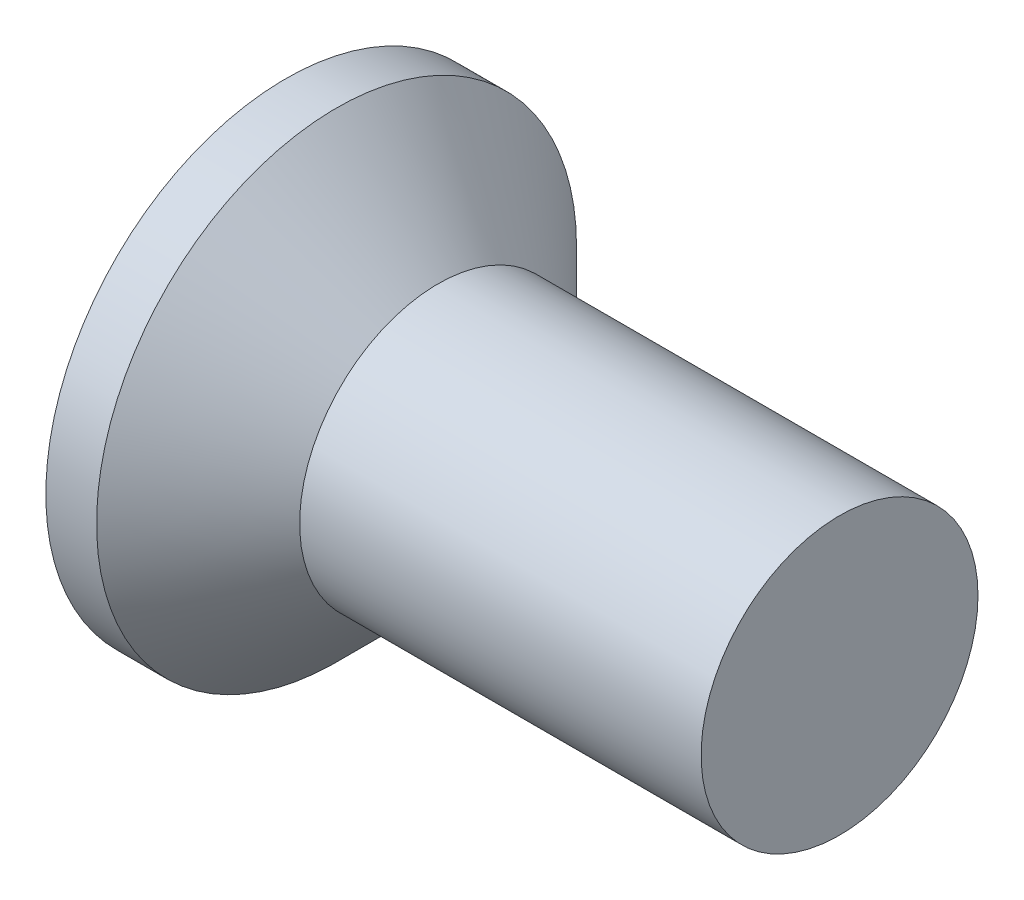
ISO-10303-21;
HEADER;
FILE_DESCRIPTION(('STEP AP214'),'2;1');
FILE_NAME('part.step','',(''),(''),'','','');
FILE_SCHEMA(('AUTOMOTIVE_DESIGN { 1 0 10303 214 1 1 1 1 }'));
ENDSEC;
DATA;
#1=APPLICATION_CONTEXT('core data for automotive mechanical design processes');
#2=APPLICATION_PROTOCOL_DEFINITION('international standard','automotive_design',2000,#1);
#3=PRODUCT_CONTEXT('',#1,'mechanical');
#4=PRODUCT('Part','Part','',(#3));
#5=PRODUCT_RELATED_PRODUCT_CATEGORY('part','',(#4));
#6=PRODUCT_DEFINITION_FORMATION('','',#4);
#7=PRODUCT_DEFINITION_CONTEXT('part definition',#1,'design');
#8=PRODUCT_DEFINITION('design','',#6,#7);
#9=PRODUCT_DEFINITION_SHAPE('','',#8);
#10=(LENGTH_UNIT() NAMED_UNIT(*) SI_UNIT(.MILLI.,.METRE.));
#11=(NAMED_UNIT(*) PLANE_ANGLE_UNIT() SI_UNIT($,.RADIAN.));
#12=(NAMED_UNIT(*) SI_UNIT($,.STERADIAN.) SOLID_ANGLE_UNIT());
#13=UNCERTAINTY_MEASURE_WITH_UNIT(LENGTH_MEASURE(1.E-05),#10,'distance_accuracy_value','');
#14=(GEOMETRIC_REPRESENTATION_CONTEXT(3) GLOBAL_UNCERTAINTY_ASSIGNED_CONTEXT((#13)) GLOBAL_UNIT_ASSIGNED_CONTEXT((#10,
#11,#12)) REPRESENTATION_CONTEXT('',''));
#15=CARTESIAN_POINT('',(0.,0.,0.));
#16=DIRECTION('',(0.,0.,1.));
#17=DIRECTION('',(1.,0.,0.));
#18=AXIS2_PLACEMENT_3D('',#15,#16,#17);
#19=CARTESIAN_POINT('',(0.,2.59999999999999,0.));
#20=DIRECTION('',(-1.,0.,0.));
#21=DIRECTION('',(0.,0.,1.));
#22=AXIS2_PLACEMENT_3D('',#19,#20,#21);
#23=PLANE('',#22);
#24=CARTESIAN_POINT('',(0.,0.,0.));
#25=DIRECTION('',(1.,0.,0.));
#26=DIRECTION('',(0.,0.,-1.));
#27=AXIS2_PLACEMENT_3D('',#24,#25,#26);
#28=CIRCLE('',#27,2.59999999999999);
#29=CARTESIAN_POINT('',(0.,0.,-2.59999999999999));
#30=VERTEX_POINT('',#29);
#31=EDGE_CURVE('E181',#30,#30,#28,.T.);
#32=ORIENTED_EDGE('',*,*,#31,.F.);
#33=EDGE_LOOP('',(#32));
#34=FACE_BOUND('',#33,.T.);
#35=DIRECTION('',(0.,1.,0.));
#36=VECTOR('',#35,1.);
#37=CARTESIAN_POINT('',(0.,-0.32,-0.32));
#38=LINE('',#37,#36);
#39=CARTESIAN_POINT('',(0.,-1.6,-0.32));
#40=VERTEX_POINT('',#39);
#41=CARTESIAN_POINT('',(0.,-0.62,-0.32));
#42=VERTEX_POINT('',#41);
#43=EDGE_CURVE('E307',#40,#42,#38,.T.);
#44=ORIENTED_EDGE('',*,*,#43,.T.);
#45=CARTESIAN_POINT('',(0.,-0.62,-0.62));
#46=DIRECTION('',(-1.,0.,0.));
#47=DIRECTION('',(0.,0.,1.));
#48=AXIS2_PLACEMENT_3D('',#45,#46,#47);
#49=CIRCLE('',#48,0.3);
#50=CARTESIAN_POINT('',(0.,-0.32,-0.62));
#51=VERTEX_POINT('',#50);
#52=EDGE_CURVE('E186',#42,#51,#49,.T.);
#53=ORIENTED_EDGE('',*,*,#52,.T.);
#54=DIRECTION('',(0.,0.,-1.));
#55=VECTOR('',#54,1.);
#56=CARTESIAN_POINT('',(0.,-0.32,-0.32));
#57=LINE('',#56,#55);
#58=CARTESIAN_POINT('',(0.,-0.32,-1.6));
#59=VERTEX_POINT('',#58);
#60=EDGE_CURVE('E309',#51,#59,#57,.T.);
#61=ORIENTED_EDGE('',*,*,#60,.T.);
#62=DIRECTION('',(0.,1.,0.));
#63=VECTOR('',#62,1.);
#64=CARTESIAN_POINT('',(0.,0.32,-1.6));
#65=LINE('',#64,#63);
#66=CARTESIAN_POINT('',(0.,0.32,-1.6));
#67=VERTEX_POINT('',#66);
#68=EDGE_CURVE('E311',#59,#67,#65,.T.);
#69=ORIENTED_EDGE('',*,*,#68,.T.);
#70=DIRECTION('',(0.,0.,1.));
#71=VECTOR('',#70,1.);
#72=CARTESIAN_POINT('',(0.,0.32,-0.32));
#73=LINE('',#72,#71);
#74=CARTESIAN_POINT('',(0.,0.32,-0.62));
#75=VERTEX_POINT('',#74);
#76=EDGE_CURVE('E314',#67,#75,#73,.T.);
#77=ORIENTED_EDGE('',*,*,#76,.T.);
#78=CARTESIAN_POINT('',(0.,0.62,-0.62));
#79=DIRECTION('',(-1.,0.,0.));
#80=DIRECTION('',(0.,0.,1.));
#81=AXIS2_PLACEMENT_3D('',#78,#79,#80);
#82=CIRCLE('',#81,0.3);
#83=CARTESIAN_POINT('',(0.,0.62,-0.32));
#84=VERTEX_POINT('',#83);
#85=EDGE_CURVE('E184',#75,#84,#82,.T.);
#86=ORIENTED_EDGE('',*,*,#85,.T.);
#87=DIRECTION('',(0.,1.,0.));
#88=VECTOR('',#87,1.);
#89=CARTESIAN_POINT('',(0.,0.32,-0.32));
#90=LINE('',#89,#88);
#91=CARTESIAN_POINT('',(0.,1.6,-0.32));
#92=VERTEX_POINT('',#91);
#93=EDGE_CURVE('E317',#84,#92,#90,.T.);
#94=ORIENTED_EDGE('',*,*,#93,.T.);
#95=DIRECTION('',(0.,0.,1.));
#96=VECTOR('',#95,1.);
#97=CARTESIAN_POINT('',(0.,1.6,-0.32));
#98=LINE('',#97,#96);
#99=CARTESIAN_POINT('',(0.,1.6,0.32));
#100=VERTEX_POINT('',#99);
#101=EDGE_CURVE('E319',#92,#100,#98,.T.);
#102=ORIENTED_EDGE('',*,*,#101,.T.);
#103=DIRECTION('',(0.,-1.,0.));
#104=VECTOR('',#103,1.);
#105=CARTESIAN_POINT('',(0.,0.32,0.32));
#106=LINE('',#105,#104);
#107=CARTESIAN_POINT('',(0.,0.62,0.32));
#108=VERTEX_POINT('',#107);
#109=EDGE_CURVE('E322',#100,#108,#106,.T.);
#110=ORIENTED_EDGE('',*,*,#109,.T.);
#111=CARTESIAN_POINT('',(0.,0.62,0.62));
#112=DIRECTION('',(-1.,0.,0.));
#113=DIRECTION('',(0.,0.,1.));
#114=AXIS2_PLACEMENT_3D('',#111,#112,#113);
#115=CIRCLE('',#114,0.3);
#116=CARTESIAN_POINT('',(0.,0.32,0.62));
#117=VERTEX_POINT('',#116);
#118=EDGE_CURVE('E149',#108,#117,#115,.T.);
#119=ORIENTED_EDGE('',*,*,#118,.T.);
#120=DIRECTION('',(0.,0.,1.));
#121=VECTOR('',#120,1.);
#122=CARTESIAN_POINT('',(0.,0.32,0.32));
#123=LINE('',#122,#121);
#124=CARTESIAN_POINT('',(0.,0.32,1.6));
#125=VERTEX_POINT('',#124);
#126=EDGE_CURVE('E143',#117,#125,#123,.T.);
#127=ORIENTED_EDGE('',*,*,#126,.T.);
#128=DIRECTION('',(0.,-1.,0.));
#129=VECTOR('',#128,1.);
#130=CARTESIAN_POINT('',(0.,0.32,1.6));
#131=LINE('',#130,#129);
#132=CARTESIAN_POINT('',(0.,-0.32,1.6));
#133=VERTEX_POINT('',#132);
#134=EDGE_CURVE('E147',#125,#133,#131,.T.);
#135=ORIENTED_EDGE('',*,*,#134,.T.);
#136=DIRECTION('',(0.,0.,-1.));
#137=VECTOR('',#136,1.);
#138=CARTESIAN_POINT('',(0.,-0.32,0.32));
#139=LINE('',#138,#137);
#140=CARTESIAN_POINT('',(0.,-0.32,0.62));
#141=VERTEX_POINT('',#140);
#142=EDGE_CURVE('E161',#133,#141,#139,.T.);
#143=ORIENTED_EDGE('',*,*,#142,.T.);
#144=CARTESIAN_POINT('',(0.,-0.62,0.62));
#145=DIRECTION('',(-1.,0.,0.));
#146=DIRECTION('',(0.,0.,1.));
#147=AXIS2_PLACEMENT_3D('',#144,#145,#146);
#148=CIRCLE('',#147,0.3);
#149=CARTESIAN_POINT('',(0.,-0.62,0.32));
#150=VERTEX_POINT('',#149);
#151=EDGE_CURVE('E180',#141,#150,#148,.T.);
#152=ORIENTED_EDGE('',*,*,#151,.T.);
#153=DIRECTION('',(0.,-1.,0.));
#154=VECTOR('',#153,1.);
#155=CARTESIAN_POINT('',(0.,-0.32,0.32));
#156=LINE('',#155,#154);
#157=CARTESIAN_POINT('',(0.,-1.6,0.319999999999999));
#158=VERTEX_POINT('',#157);
#159=EDGE_CURVE('E302',#150,#158,#156,.T.);
#160=ORIENTED_EDGE('',*,*,#159,.T.);
#161=DIRECTION('',(0.,0.,-1.));
#162=VECTOR('',#161,1.);
#163=CARTESIAN_POINT('',(0.,-1.6,-0.32));
#164=LINE('',#163,#162);
#165=EDGE_CURVE('E304',#158,#40,#164,.T.);
#166=ORIENTED_EDGE('',*,*,#165,.T.);
#167=EDGE_LOOP('',(#44,#53,#61,#69,#77,#86,#94,#102,#110,#119,#127,#135,#143,#152,#160,#166));
#168=FACE_BOUND('',#167,.T.);
#169=ADVANCED_FACE('F30',(#34,#168),#23,.T.);
#170=CARTESIAN_POINT('',(5.99999999999999,1.49999999999999,0.));
#171=DIRECTION('',(1.,0.,0.));
#172=DIRECTION('',(0.,0.,-1.));
#173=AXIS2_PLACEMENT_3D('',#170,#171,#172);
#174=PLANE('',#173);
#175=CARTESIAN_POINT('',(5.99999999999999,0.,0.));
#176=DIRECTION('',(1.,0.,0.));
#177=DIRECTION('',(0.,0.,-1.));
#178=AXIS2_PLACEMENT_3D('',#175,#176,#177);
#179=CIRCLE('',#178,1.49999999999999);
#180=CARTESIAN_POINT('',(5.99999999999999,0.,-1.49999999999999));
#181=VERTEX_POINT('',#180);
#182=EDGE_CURVE('E167',#181,#181,#179,.T.);
#183=ORIENTED_EDGE('',*,*,#182,.T.);
#184=EDGE_LOOP('',(#183));
#185=FACE_BOUND('',#184,.T.);
#186=ADVANCED_FACE('F234',(#185),#174,.T.);
#187=CARTESIAN_POINT('',(4.51581291088132,0.,0.));
#188=DIRECTION('',(1.,0.,0.));
#189=DIRECTION('',(0.,0.,-1.));
#190=AXIS2_PLACEMENT_3D('',#187,#188,#189);
#191=CYLINDRICAL_SURFACE('',#190,2.59999999999999);
#192=ORIENTED_EDGE('',*,*,#31,.T.);
#193=EDGE_LOOP('',(#192));
#194=FACE_BOUND('',#193,.T.);
#195=CARTESIAN_POINT('',(0.550000000000004,0.,0.));
#196=DIRECTION('',(1.,0.,0.));
#197=DIRECTION('',(0.,0.,-1.));
#198=AXIS2_PLACEMENT_3D('',#195,#196,#197);
#199=CIRCLE('',#198,2.59999999999999);
#200=CARTESIAN_POINT('',(0.550000000000004,0.,-2.59999999999999));
#201=VERTEX_POINT('',#200);
#202=EDGE_CURVE('E326',#201,#201,#199,.T.);
#203=ORIENTED_EDGE('',*,*,#202,.F.);
#204=EDGE_LOOP('',(#203));
#205=FACE_BOUND('',#204,.T.);
#206=ADVANCED_FACE('F240',(#194,#205),#191,.T.);
#207=CARTESIAN_POINT('',(1.65,0.,0.));
#208=DIRECTION('',(-1.,0.,0.));
#209=DIRECTION('',(0.,0.,1.));
#210=AXIS2_PLACEMENT_3D('',#207,#208,#209);
#211=CONICAL_SURFACE('',#210,1.49999999999999,0.78539816339745);
#212=ORIENTED_EDGE('',*,*,#202,.T.);
#213=EDGE_LOOP('',(#212));
#214=FACE_BOUND('',#213,.T.);
#215=CARTESIAN_POINT('',(1.65,0.,0.));
#216=DIRECTION('',(1.,0.,0.));
#217=DIRECTION('',(0.,0.,-1.));
#218=AXIS2_PLACEMENT_3D('',#215,#216,#217);
#219=CIRCLE('',#218,1.49999999999999);
#220=CARTESIAN_POINT('',(1.65,0.,-1.49999999999999));
#221=VERTEX_POINT('',#220);
#222=EDGE_CURVE('E170',#221,#221,#219,.T.);
#223=ORIENTED_EDGE('',*,*,#222,.F.);
#224=EDGE_LOOP('',(#223));
#225=FACE_BOUND('',#224,.T.);
#226=ADVANCED_FACE('F362',(#214,#225),#211,.T.);
#227=CARTESIAN_POINT('',(4.51581291088132,0.,0.));
#228=DIRECTION('',(1.,0.,0.));
#229=DIRECTION('',(0.,0.,-1.));
#230=AXIS2_PLACEMENT_3D('',#227,#228,#229);
#231=CYLINDRICAL_SURFACE('',#230,1.49999999999999);
#232=ORIENTED_EDGE('',*,*,#222,.T.);
#233=EDGE_LOOP('',(#232));
#234=FACE_BOUND('',#233,.T.);
#235=ORIENTED_EDGE('',*,*,#182,.F.);
#236=EDGE_LOOP('',(#235));
#237=FACE_BOUND('',#236,.T.);
#238=ADVANCED_FACE('F360',(#234,#237),#231,.T.);
#239=CARTESIAN_POINT('',(0.825,0.32,0.32));
#240=DIRECTION('',(0.,-1.,0.));
#241=DIRECTION('',(0.,0.,-1.));
#242=AXIS2_PLACEMENT_3D('',#239,#240,#241);
#243=PLANE('',#242);
#244=ORIENTED_EDGE('',*,*,#126,.F.);
#245=DIRECTION('',(-1.,0.,0.));
#246=VECTOR('',#245,1.);
#247=CARTESIAN_POINT('',(0.825,0.32,0.62));
#248=LINE('',#247,#246);
#249=CARTESIAN_POINT('',(0.825,0.32,0.62));
#250=VERTEX_POINT('',#249);
#251=EDGE_CURVE('E198',#117,#250,#248,.F.);
#252=ORIENTED_EDGE('',*,*,#251,.T.);
#253=DIRECTION('',(0.,0.,1.));
#254=VECTOR('',#253,1.);
#255=CARTESIAN_POINT('',(0.825,0.32,0.32));
#256=LINE('',#255,#254);
#257=CARTESIAN_POINT('',(0.825,0.32,1.12368602791856));
#258=VERTEX_POINT('',#257);
#259=EDGE_CURVE('E165',#250,#258,#256,.T.);
#260=ORIENTED_EDGE('',*,*,#259,.T.);
#261=DIRECTION('',(-0.866025403784438,0.,0.500000000000001));
#262=VECTOR('',#261,1.);
#263=CARTESIAN_POINT('',(0.,0.32,1.6));
#264=LINE('',#263,#262);
#265=EDGE_CURVE('E157',#258,#125,#264,.T.);
#266=ORIENTED_EDGE('',*,*,#265,.T.);
#267=EDGE_LOOP('',(#244,#252,#260,#266));
#268=FACE_BOUND('',#267,.T.);
#269=ADVANCED_FACE('F163',(#268),#243,.T.);
#270=CARTESIAN_POINT('',(0.,0.32,1.6));
#271=DIRECTION('',(-0.500000000000001,0.,-0.866025403784438));
#272=DIRECTION('',(-0.866025403784438,0.,0.500000000000001));
#273=AXIS2_PLACEMENT_3D('',#270,#271,#272);
#274=PLANE('',#273);
#275=ORIENTED_EDGE('',*,*,#134,.F.);
#276=ORIENTED_EDGE('',*,*,#265,.F.);
#277=DIRECTION('',(0.,-1.,0.));
#278=VECTOR('',#277,1.);
#279=CARTESIAN_POINT('',(0.825,0.32,1.12368602791856));
#280=LINE('',#279,#278);
#281=CARTESIAN_POINT('',(0.825,-0.32,1.12368602791856));
#282=VERTEX_POINT('',#281);
#283=EDGE_CURVE('E176',#258,#282,#280,.T.);
#284=ORIENTED_EDGE('',*,*,#283,.T.);
#285=DIRECTION('',(-0.866025403784438,0.,0.500000000000001));
#286=VECTOR('',#285,1.);
#287=CARTESIAN_POINT('',(1.17300625842204,-0.32,0.922764520938917));
#288=LINE('',#287,#286);
#289=EDGE_CURVE('E159',#282,#133,#288,.T.);
#290=ORIENTED_EDGE('',*,*,#289,.T.);
#291=EDGE_LOOP('',(#275,#276,#284,#290));
#292=FACE_BOUND('',#291,.T.);
#293=ADVANCED_FACE('F156',(#292),#274,.T.);
#294=CARTESIAN_POINT('',(0.825,-0.32,0.32));
#295=DIRECTION('',(0.,1.,0.));
#296=DIRECTION('',(0.,0.,1.));
#297=AXIS2_PLACEMENT_3D('',#294,#295,#296);
#298=PLANE('',#297);
#299=DIRECTION('',(0.,0.,-1.));
#300=VECTOR('',#299,1.);
#301=CARTESIAN_POINT('',(0.825,-0.32,0.32));
#302=LINE('',#301,#300);
#303=CARTESIAN_POINT('',(0.825,-0.32,0.62));
#304=VERTEX_POINT('',#303);
#305=EDGE_CURVE('E348',#282,#304,#302,.T.);
#306=ORIENTED_EDGE('',*,*,#305,.T.);
#307=DIRECTION('',(-1.,0.,0.));
#308=VECTOR('',#307,1.);
#309=CARTESIAN_POINT('',(0.825,-0.32,0.62));
#310=LINE('',#309,#308);
#311=EDGE_CURVE('E200',#304,#141,#310,.T.);
#312=ORIENTED_EDGE('',*,*,#311,.T.);
#313=ORIENTED_EDGE('',*,*,#142,.F.);
#314=ORIENTED_EDGE('',*,*,#289,.F.);
#315=EDGE_LOOP('',(#306,#312,#313,#314));
#316=FACE_BOUND('',#315,.T.);
#317=ADVANCED_FACE('F254',(#316),#298,.T.);
#318=CARTESIAN_POINT('',(0.825,-0.32,0.32));
#319=DIRECTION('',(0.,0.,-1.));
#320=DIRECTION('',(0.,1.,0.));
#321=AXIS2_PLACEMENT_3D('',#318,#319,#320);
#322=PLANE('',#321);
#323=ORIENTED_EDGE('',*,*,#159,.F.);
#324=DIRECTION('',(-1.,0.,0.));
#325=VECTOR('',#324,1.);
#326=CARTESIAN_POINT('',(0.825,-0.62,0.32));
#327=LINE('',#326,#325);
#328=CARTESIAN_POINT('',(0.825,-0.62,0.32));
#329=VERTEX_POINT('',#328);
#330=EDGE_CURVE('E45',#150,#329,#327,.F.);
#331=ORIENTED_EDGE('',*,*,#330,.T.);
#332=DIRECTION('',(0.,-1.,0.));
#333=VECTOR('',#332,1.);
#334=CARTESIAN_POINT('',(0.825,-0.32,0.32));
#335=LINE('',#334,#333);
#336=CARTESIAN_POINT('',(0.825,-1.12368602791856,0.319999999999999));
#337=VERTEX_POINT('',#336);
#338=EDGE_CURVE('E291',#329,#337,#335,.T.);
#339=ORIENTED_EDGE('',*,*,#338,.T.);
#340=DIRECTION('',(-0.866025403784438,-0.500000000000001,0.));
#341=VECTOR('',#340,1.);
#342=CARTESIAN_POINT('',(0.,-1.6,0.319999999999999));
#343=LINE('',#342,#341);
#344=EDGE_CURVE('E172',#337,#158,#343,.T.);
#345=ORIENTED_EDGE('',*,*,#344,.T.);
#346=EDGE_LOOP('',(#323,#331,#339,#345));
#347=FACE_BOUND('',#346,.T.);
#348=ADVANCED_FACE('F259',(#347),#322,.T.);
#349=CARTESIAN_POINT('',(0.,-1.6,-0.32));
#350=DIRECTION('',(-0.500000000000001,0.866025403784438,0.));
#351=DIRECTION('',(-0.866025403784438,-0.500000000000001,0.));
#352=AXIS2_PLACEMENT_3D('',#349,#350,#351);
#353=PLANE('',#352);
#354=ORIENTED_EDGE('',*,*,#165,.F.);
#355=ORIENTED_EDGE('',*,*,#344,.F.);
#356=DIRECTION('',(0.,0.,-1.));
#357=VECTOR('',#356,1.);
#358=CARTESIAN_POINT('',(0.825,-1.12368602791856,-0.32));
#359=LINE('',#358,#357);
#360=CARTESIAN_POINT('',(0.825,-1.12368602791856,-0.32));
#361=VERTEX_POINT('',#360);
#362=EDGE_CURVE('E287',#337,#361,#359,.T.);
#363=ORIENTED_EDGE('',*,*,#362,.T.);
#364=DIRECTION('',(-0.866025403784438,-0.500000000000001,0.));
#365=VECTOR('',#364,1.);
#366=CARTESIAN_POINT('',(1.17300625842204,-0.922764520938917,-0.32));
#367=LINE('',#366,#365);
#368=EDGE_CURVE('E286',#361,#40,#367,.T.);
#369=ORIENTED_EDGE('',*,*,#368,.T.);
#370=EDGE_LOOP('',(#354,#355,#363,#369));
#371=FACE_BOUND('',#370,.T.);
#372=ADVANCED_FACE('F255',(#371),#353,.T.);
#373=CARTESIAN_POINT('',(0.825,-0.32,-0.32));
#374=DIRECTION('',(0.,0.,1.));
#375=DIRECTION('',(0.,-1.,0.));
#376=AXIS2_PLACEMENT_3D('',#373,#374,#375);
#377=PLANE('',#376);
#378=DIRECTION('',(0.,1.,0.));
#379=VECTOR('',#378,1.);
#380=CARTESIAN_POINT('',(0.825,-0.32,-0.32));
#381=LINE('',#380,#379);
#382=CARTESIAN_POINT('',(0.825,-0.62,-0.32));
#383=VERTEX_POINT('',#382);
#384=EDGE_CURVE('E280',#361,#383,#381,.T.);
#385=ORIENTED_EDGE('',*,*,#384,.T.);
#386=DIRECTION('',(-1.,0.,0.));
#387=VECTOR('',#386,1.);
#388=CARTESIAN_POINT('',(0.825,-0.62,-0.32));
#389=LINE('',#388,#387);
#390=EDGE_CURVE('E177',#383,#42,#389,.T.);
#391=ORIENTED_EDGE('',*,*,#390,.T.);
#392=ORIENTED_EDGE('',*,*,#43,.F.);
#393=ORIENTED_EDGE('',*,*,#368,.F.);
#394=EDGE_LOOP('',(#385,#391,#392,#393));
#395=FACE_BOUND('',#394,.T.);
#396=ADVANCED_FACE('F258',(#395),#377,.T.);
#397=CARTESIAN_POINT('',(0.825,-0.32,-0.32));
#398=DIRECTION('',(0.,1.,0.));
#399=DIRECTION('',(0.,0.,1.));
#400=AXIS2_PLACEMENT_3D('',#397,#398,#399);
#401=PLANE('',#400);
#402=ORIENTED_EDGE('',*,*,#60,.F.);
#403=DIRECTION('',(-1.,0.,0.));
#404=VECTOR('',#403,1.);
#405=CARTESIAN_POINT('',(0.825,-0.32,-0.62));
#406=LINE('',#405,#404);
#407=CARTESIAN_POINT('',(0.825,-0.32,-0.62));
#408=VERTEX_POINT('',#407);
#409=EDGE_CURVE('E188',#51,#408,#406,.F.);
#410=ORIENTED_EDGE('',*,*,#409,.T.);
#411=DIRECTION('',(0.,0.,-1.));
#412=VECTOR('',#411,1.);
#413=CARTESIAN_POINT('',(0.825,-0.32,-0.32));
#414=LINE('',#413,#412);
#415=CARTESIAN_POINT('',(0.825,-0.32,-1.12368602791856));
#416=VERTEX_POINT('',#415);
#417=EDGE_CURVE('E282',#408,#416,#414,.T.);
#418=ORIENTED_EDGE('',*,*,#417,.T.);
#419=DIRECTION('',(-0.866025403784438,0.,-0.500000000000001));
#420=VECTOR('',#419,1.);
#421=CARTESIAN_POINT('',(0.,-0.32,-1.6));
#422=LINE('',#421,#420);
#423=EDGE_CURVE('E338',#416,#59,#422,.T.);
#424=ORIENTED_EDGE('',*,*,#423,.T.);
#425=EDGE_LOOP('',(#402,#410,#418,#424));
#426=FACE_BOUND('',#425,.T.);
#427=ADVANCED_FACE('F265',(#426),#401,.T.);
#428=CARTESIAN_POINT('',(0.,0.32,-1.6));
#429=DIRECTION('',(-0.500000000000001,0.,0.866025403784438));
#430=DIRECTION('',(0.866025403784438,0.,0.500000000000001));
#431=AXIS2_PLACEMENT_3D('',#428,#429,#430);
#432=PLANE('',#431);
#433=ORIENTED_EDGE('',*,*,#68,.F.);
#434=ORIENTED_EDGE('',*,*,#423,.F.);
#435=DIRECTION('',(0.,1.,0.));
#436=VECTOR('',#435,1.);
#437=CARTESIAN_POINT('',(0.825,0.32,-1.12368602791856));
#438=LINE('',#437,#436);
#439=CARTESIAN_POINT('',(0.825,0.32,-1.12368602791856));
#440=VERTEX_POINT('',#439);
#441=EDGE_CURVE('E289',#416,#440,#438,.T.);
#442=ORIENTED_EDGE('',*,*,#441,.T.);
#443=DIRECTION('',(-0.866025403784438,0.,-0.500000000000001));
#444=VECTOR('',#443,1.);
#445=CARTESIAN_POINT('',(1.17300625842204,0.32,-0.922764520938917));
#446=LINE('',#445,#444);
#447=EDGE_CURVE('E336',#440,#67,#446,.T.);
#448=ORIENTED_EDGE('',*,*,#447,.T.);
#449=EDGE_LOOP('',(#433,#434,#442,#448));
#450=FACE_BOUND('',#449,.T.);
#451=ADVANCED_FACE('F261',(#450),#432,.T.);
#452=CARTESIAN_POINT('',(0.825,0.32,-0.32));
#453=DIRECTION('',(0.,-1.,0.));
#454=DIRECTION('',(0.,0.,-1.));
#455=AXIS2_PLACEMENT_3D('',#452,#453,#454);
#456=PLANE('',#455);
#457=DIRECTION('',(0.,0.,1.));
#458=VECTOR('',#457,1.);
#459=CARTESIAN_POINT('',(0.825,0.32,-0.32));
#460=LINE('',#459,#458);
#461=CARTESIAN_POINT('',(0.825,0.32,-0.62));
#462=VERTEX_POINT('',#461);
#463=EDGE_CURVE('E296',#440,#462,#460,.T.);
#464=ORIENTED_EDGE('',*,*,#463,.T.);
#465=DIRECTION('',(-1.,0.,0.));
#466=VECTOR('',#465,1.);
#467=CARTESIAN_POINT('',(0.825,0.32,-0.62));
#468=LINE('',#467,#466);
#469=EDGE_CURVE('E190',#462,#75,#468,.T.);
#470=ORIENTED_EDGE('',*,*,#469,.T.);
#471=ORIENTED_EDGE('',*,*,#76,.F.);
#472=ORIENTED_EDGE('',*,*,#447,.F.);
#473=EDGE_LOOP('',(#464,#470,#471,#472));
#474=FACE_BOUND('',#473,.T.);
#475=ADVANCED_FACE('F264',(#474),#456,.T.);
#476=CARTESIAN_POINT('',(0.825,0.32,-0.32));
#477=DIRECTION('',(0.,0.,1.));
#478=DIRECTION('',(0.,-1.,0.));
#479=AXIS2_PLACEMENT_3D('',#476,#477,#478);
#480=PLANE('',#479);
#481=ORIENTED_EDGE('',*,*,#93,.F.);
#482=DIRECTION('',(-1.,0.,0.));
#483=VECTOR('',#482,1.);
#484=CARTESIAN_POINT('',(0.825,0.62,-0.32));
#485=LINE('',#484,#483);
#486=CARTESIAN_POINT('',(0.825,0.62,-0.32));
#487=VERTEX_POINT('',#486);
#488=EDGE_CURVE('E193',#84,#487,#485,.F.);
#489=ORIENTED_EDGE('',*,*,#488,.T.);
#490=DIRECTION('',(0.,1.,0.));
#491=VECTOR('',#490,1.);
#492=CARTESIAN_POINT('',(0.825,0.32,-0.32));
#493=LINE('',#492,#491);
#494=CARTESIAN_POINT('',(0.825,1.12368602791856,-0.32));
#495=VERTEX_POINT('',#494);
#496=EDGE_CURVE('E299',#487,#495,#493,.T.);
#497=ORIENTED_EDGE('',*,*,#496,.T.);
#498=DIRECTION('',(-0.866025403784438,0.500000000000001,0.));
#499=VECTOR('',#498,1.);
#500=CARTESIAN_POINT('',(0.,1.6,-0.32));
#501=LINE('',#500,#499);
#502=EDGE_CURVE('E332',#495,#92,#501,.T.);
#503=ORIENTED_EDGE('',*,*,#502,.T.);
#504=EDGE_LOOP('',(#481,#489,#497,#503));
#505=FACE_BOUND('',#504,.T.);
#506=ADVANCED_FACE('F250',(#505),#480,.T.);
#507=CARTESIAN_POINT('',(0.,1.6,-0.32));
#508=DIRECTION('',(-0.500000000000001,-0.866025403784438,0.));
#509=DIRECTION('',(0.866025403784438,-0.500000000000001,0.));
#510=AXIS2_PLACEMENT_3D('',#507,#508,#509);
#511=PLANE('',#510);
#512=ORIENTED_EDGE('',*,*,#101,.F.);
#513=ORIENTED_EDGE('',*,*,#502,.F.);
#514=DIRECTION('',(0.,0.,1.));
#515=VECTOR('',#514,1.);
#516=CARTESIAN_POINT('',(0.825,1.12368602791856,-0.32));
#517=LINE('',#516,#515);
#518=CARTESIAN_POINT('',(0.825,1.12368602791856,0.32));
#519=VERTEX_POINT('',#518);
#520=EDGE_CURVE('E220',#495,#519,#517,.T.);
#521=ORIENTED_EDGE('',*,*,#520,.T.);
#522=DIRECTION('',(-0.866025403784438,0.500000000000001,0.));
#523=VECTOR('',#522,1.);
#524=CARTESIAN_POINT('',(1.17300625842204,0.922764520938917,0.32));
#525=LINE('',#524,#523);
#526=EDGE_CURVE('E219',#519,#100,#525,.T.);
#527=ORIENTED_EDGE('',*,*,#526,.T.);
#528=EDGE_LOOP('',(#512,#513,#521,#527));
#529=FACE_BOUND('',#528,.T.);
#530=ADVANCED_FACE('F247',(#529),#511,.T.);
#531=CARTESIAN_POINT('',(0.825,0.32,0.32));
#532=DIRECTION('',(0.,0.,-1.));
#533=DIRECTION('',(0.,1.,0.));
#534=AXIS2_PLACEMENT_3D('',#531,#532,#533);
#535=PLANE('',#534);
#536=DIRECTION('',(0.,-1.,0.));
#537=VECTOR('',#536,1.);
#538=CARTESIAN_POINT('',(0.825,0.32,0.32));
#539=LINE('',#538,#537);
#540=CARTESIAN_POINT('',(0.825,0.62,0.32));
#541=VERTEX_POINT('',#540);
#542=EDGE_CURVE('E212',#519,#541,#539,.T.);
#543=ORIENTED_EDGE('',*,*,#542,.T.);
#544=DIRECTION('',(-1.,0.,0.));
#545=VECTOR('',#544,1.);
#546=CARTESIAN_POINT('',(0.825,0.62,0.32));
#547=LINE('',#546,#545);
#548=EDGE_CURVE('E195',#541,#108,#547,.T.);
#549=ORIENTED_EDGE('',*,*,#548,.T.);
#550=ORIENTED_EDGE('',*,*,#109,.F.);
#551=ORIENTED_EDGE('',*,*,#526,.F.);
#552=EDGE_LOOP('',(#543,#549,#550,#551));
#553=FACE_BOUND('',#552,.T.);
#554=ADVANCED_FACE('F217',(#553),#535,.T.);
#555=CARTESIAN_POINT('',(0.825,0.32,0.32));
#556=DIRECTION('',(1.,0.,0.));
#557=DIRECTION('',(0.,0.,-1.));
#558=AXIS2_PLACEMENT_3D('',#555,#556,#557);
#559=PLANE('',#558);
#560=ORIENTED_EDGE('',*,*,#259,.F.);
#561=CARTESIAN_POINT('',(0.825,0.62,0.62));
#562=DIRECTION('',(1.,0.,0.));
#563=DIRECTION('',(0.,0.,-1.));
#564=AXIS2_PLACEMENT_3D('',#561,#562,#563);
#565=CIRCLE('',#564,0.3);
#566=EDGE_CURVE('E38',#250,#541,#565,.T.);
#567=ORIENTED_EDGE('',*,*,#566,.T.);
#568=ORIENTED_EDGE('',*,*,#542,.F.);
#569=ORIENTED_EDGE('',*,*,#520,.F.);
#570=ORIENTED_EDGE('',*,*,#496,.F.);
#571=CARTESIAN_POINT('',(0.825,0.62,-0.62));
#572=DIRECTION('',(1.,0.,0.));
#573=DIRECTION('',(0.,0.,-1.));
#574=AXIS2_PLACEMENT_3D('',#571,#572,#573);
#575=CIRCLE('',#574,0.3);
#576=EDGE_CURVE('E206',#487,#462,#575,.T.);
#577=ORIENTED_EDGE('',*,*,#576,.T.);
#578=ORIENTED_EDGE('',*,*,#463,.F.);
#579=ORIENTED_EDGE('',*,*,#441,.F.);
#580=ORIENTED_EDGE('',*,*,#417,.F.);
#581=CARTESIAN_POINT('',(0.825,-0.62,-0.62));
#582=DIRECTION('',(1.,0.,0.));
#583=DIRECTION('',(0.,0.,-1.));
#584=AXIS2_PLACEMENT_3D('',#581,#582,#583);
#585=CIRCLE('',#584,0.3);
#586=EDGE_CURVE('E204',#408,#383,#585,.T.);
#587=ORIENTED_EDGE('',*,*,#586,.T.);
#588=ORIENTED_EDGE('',*,*,#384,.F.);
#589=ORIENTED_EDGE('',*,*,#362,.F.);
#590=ORIENTED_EDGE('',*,*,#338,.F.);
#591=CARTESIAN_POINT('',(0.825,-0.62,0.62));
#592=DIRECTION('',(1.,0.,0.));
#593=DIRECTION('',(0.,0.,-1.));
#594=AXIS2_PLACEMENT_3D('',#591,#592,#593);
#595=CIRCLE('',#594,0.3);
#596=EDGE_CURVE('E11',#329,#304,#595,.T.);
#597=ORIENTED_EDGE('',*,*,#596,.T.);
#598=ORIENTED_EDGE('',*,*,#305,.F.);
#599=ORIENTED_EDGE('',*,*,#283,.F.);
#600=EDGE_LOOP('',(#560,#567,#568,#569,#570,#577,#578,#579,#580,#587,#588,#589,#590,#597,#598,#599));
#601=FACE_BOUND('',#600,.T.);
#602=ADVANCED_FACE('F210',(#601),#559,.F.);
#603=CARTESIAN_POINT('',(0.825,-0.62,-0.62));
#604=DIRECTION('',(-1.,0.,0.));
#605=DIRECTION('',(0.,0.,1.));
#606=AXIS2_PLACEMENT_3D('',#603,#604,#605);
#607=CYLINDRICAL_SURFACE('',#606,0.3);
#608=ORIENTED_EDGE('',*,*,#586,.F.);
#609=ORIENTED_EDGE('',*,*,#409,.F.);
#610=ORIENTED_EDGE('',*,*,#52,.F.);
#611=ORIENTED_EDGE('',*,*,#390,.F.);
#612=EDGE_LOOP('',(#608,#609,#610,#611));
#613=FACE_BOUND('',#612,.T.);
#614=ADVANCED_FACE('F230',(#613),#607,.T.);
#615=CARTESIAN_POINT('',(0.825,0.62,-0.62));
#616=DIRECTION('',(-1.,0.,0.));
#617=DIRECTION('',(0.,0.,1.));
#618=AXIS2_PLACEMENT_3D('',#615,#616,#617);
#619=CYLINDRICAL_SURFACE('',#618,0.3);
#620=ORIENTED_EDGE('',*,*,#576,.F.);
#621=ORIENTED_EDGE('',*,*,#488,.F.);
#622=ORIENTED_EDGE('',*,*,#85,.F.);
#623=ORIENTED_EDGE('',*,*,#469,.F.);
#624=EDGE_LOOP('',(#620,#621,#622,#623));
#625=FACE_BOUND('',#624,.T.);
#626=ADVANCED_FACE('F224',(#625),#619,.T.);
#627=CARTESIAN_POINT('',(0.825,0.62,0.62));
#628=DIRECTION('',(-1.,0.,0.));
#629=DIRECTION('',(0.,0.,1.));
#630=AXIS2_PLACEMENT_3D('',#627,#628,#629);
#631=CYLINDRICAL_SURFACE('',#630,0.3);
#632=ORIENTED_EDGE('',*,*,#566,.F.);
#633=ORIENTED_EDGE('',*,*,#251,.F.);
#634=ORIENTED_EDGE('',*,*,#118,.F.);
#635=ORIENTED_EDGE('',*,*,#548,.F.);
#636=EDGE_LOOP('',(#632,#633,#634,#635));
#637=FACE_BOUND('',#636,.T.);
#638=ADVANCED_FACE('F222',(#637),#631,.T.);
#639=CARTESIAN_POINT('',(0.825,-0.62,0.62));
#640=DIRECTION('',(-1.,0.,0.));
#641=DIRECTION('',(0.,0.,1.));
#642=AXIS2_PLACEMENT_3D('',#639,#640,#641);
#643=CYLINDRICAL_SURFACE('',#642,0.3);
#644=ORIENTED_EDGE('',*,*,#596,.F.);
#645=ORIENTED_EDGE('',*,*,#330,.F.);
#646=ORIENTED_EDGE('',*,*,#151,.F.);
#647=ORIENTED_EDGE('',*,*,#311,.F.);
#648=EDGE_LOOP('',(#644,#645,#646,#647));
#649=FACE_BOUND('',#648,.T.);
#650=ADVANCED_FACE('F32',(#649),#643,.T.);
#651=CLOSED_SHELL('',(#169,#186,#206,#226,#238,#269,#293,#317,#348,#372,#396,#427,#451,#475,
#506,#530,#554,#602,#614,#626,#638,#650));
#652=MANIFOLD_SOLID_BREP('B2',#651);
#653=ADVANCED_BREP_SHAPE_REPRESENTATION('',(#18,#652),#14);
#654=SHAPE_DEFINITION_REPRESENTATION(#9,#653);
ENDSEC;
END-ISO-10303-21;
